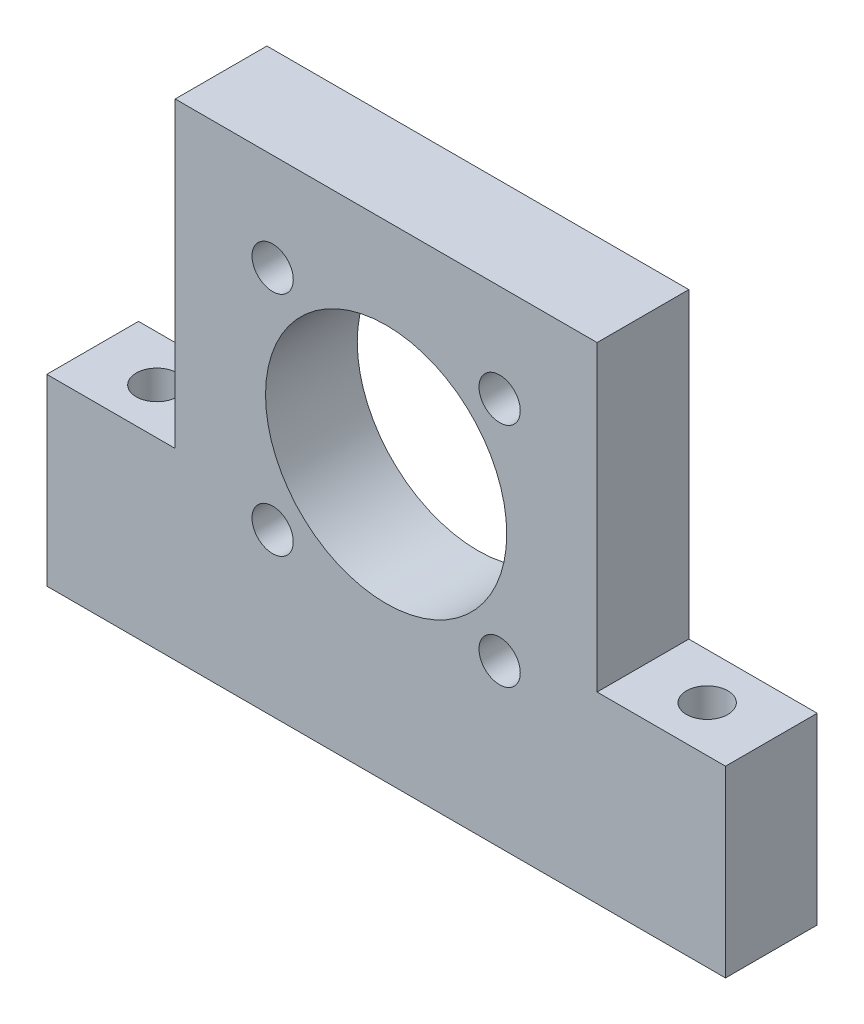
ISO-10303-21;
HEADER;
FILE_DESCRIPTION(('STEP AP214'),'2;1');
FILE_NAME('part.step','',(''),(''),'','','');
FILE_SCHEMA(('AUTOMOTIVE_DESIGN { 1 0 10303 214 1 1 1 1 }'));
ENDSEC;
DATA;
#1=APPLICATION_CONTEXT('core data for automotive mechanical design processes');
#2=APPLICATION_PROTOCOL_DEFINITION('international standard','automotive_design',2000,#1);
#3=PRODUCT_CONTEXT('',#1,'mechanical');
#4=PRODUCT('Part','Part','',(#3));
#5=PRODUCT_RELATED_PRODUCT_CATEGORY('part','',(#4));
#6=PRODUCT_DEFINITION_FORMATION('','',#4);
#7=PRODUCT_DEFINITION_CONTEXT('part definition',#1,'design');
#8=PRODUCT_DEFINITION('design','',#6,#7);
#9=PRODUCT_DEFINITION_SHAPE('','',#8);
#10=(LENGTH_UNIT() NAMED_UNIT(*) SI_UNIT(.MILLI.,.METRE.));
#11=(NAMED_UNIT(*) PLANE_ANGLE_UNIT() SI_UNIT($,.RADIAN.));
#12=(NAMED_UNIT(*) SI_UNIT($,.STERADIAN.) SOLID_ANGLE_UNIT());
#13=UNCERTAINTY_MEASURE_WITH_UNIT(LENGTH_MEASURE(1.E-05),#10,'distance_accuracy_value','');
#14=(GEOMETRIC_REPRESENTATION_CONTEXT(3) GLOBAL_UNCERTAINTY_ASSIGNED_CONTEXT((#13)) GLOBAL_UNIT_ASSIGNED_CONTEXT((#10,
#11,#12)) REPRESENTATION_CONTEXT('',''));
#15=CARTESIAN_POINT('',(0.,0.,0.));
#16=DIRECTION('',(0.,0.,1.));
#17=DIRECTION('',(1.,0.,0.));
#18=AXIS2_PLACEMENT_3D('',#15,#16,#17);
#19=CARTESIAN_POINT('',(0.,0.,10.));
#20=DIRECTION('',(0.,0.,-1.));
#21=DIRECTION('',(-1.,0.,0.));
#22=AXIS2_PLACEMENT_3D('',#19,#20,#21);
#23=PLANE('',#22);
#24=CARTESIAN_POINT('',(12.3743686707646,-12.3743686707646,10.));
#25=DIRECTION('',(0.,0.,1.));
#26=DIRECTION('',(0.,-1.,0.));
#27=AXIS2_PLACEMENT_3D('',#24,#25,#26);
#28=CIRCLE('',#27,2.25);
#29=CARTESIAN_POINT('',(12.3743686707646,-14.6243686707646,10.));
#30=VERTEX_POINT('',#29);
#31=EDGE_CURVE('E219',#30,#30,#28,.T.);
#32=ORIENTED_EDGE('',*,*,#31,.F.);
#33=EDGE_LOOP('',(#32));
#34=FACE_BOUND('',#33,.T.);
#35=CARTESIAN_POINT('',(-12.3743686707645,-12.3743686707646,10.));
#36=DIRECTION('',(0.,0.,1.));
#37=DIRECTION('',(-1.,0.,0.));
#38=AXIS2_PLACEMENT_3D('',#35,#36,#37);
#39=CIRCLE('',#38,2.25);
#40=CARTESIAN_POINT('',(-14.6243686707645,-12.3743686707646,10.));
#41=VERTEX_POINT('',#40);
#42=EDGE_CURVE('E213',#41,#41,#39,.T.);
#43=ORIENTED_EDGE('',*,*,#42,.F.);
#44=EDGE_LOOP('',(#43));
#45=FACE_BOUND('',#44,.T.);
#46=CARTESIAN_POINT('',(-12.3743686707645,12.3743686707646,10.));
#47=DIRECTION('',(0.,0.,1.));
#48=DIRECTION('',(0.,1.,0.));
#49=AXIS2_PLACEMENT_3D('',#46,#47,#48);
#50=CIRCLE('',#49,2.25);
#51=CARTESIAN_POINT('',(-12.3743686707645,14.6243686707646,10.));
#52=VERTEX_POINT('',#51);
#53=EDGE_CURVE('E207',#52,#52,#50,.T.);
#54=ORIENTED_EDGE('',*,*,#53,.F.);
#55=EDGE_LOOP('',(#54));
#56=FACE_BOUND('',#55,.T.);
#57=CARTESIAN_POINT('',(12.3743686707645,12.3743686707646,10.));
#58=DIRECTION('',(0.,0.,1.));
#59=DIRECTION('',(1.,0.,0.));
#60=AXIS2_PLACEMENT_3D('',#57,#58,#59);
#61=CIRCLE('',#60,2.25);
#62=CARTESIAN_POINT('',(14.6243686707645,12.3743686707646,10.));
#63=VERTEX_POINT('',#62);
#64=EDGE_CURVE('E201',#63,#63,#61,.T.);
#65=ORIENTED_EDGE('',*,*,#64,.F.);
#66=EDGE_LOOP('',(#65));
#67=FACE_BOUND('',#66,.T.);
#68=DIRECTION('',(0.,-1.,0.));
#69=VECTOR('',#68,1.);
#70=CARTESIAN_POINT('',(-23.,23.,10.));
#71=LINE('',#70,#69);
#72=CARTESIAN_POINT('',(-23.,23.,10.));
#73=VERTEX_POINT('',#72);
#74=CARTESIAN_POINT('',(-23.,-9.99999999999999,10.));
#75=VERTEX_POINT('',#74);
#76=EDGE_CURVE('E149',#73,#75,#71,.T.);
#77=ORIENTED_EDGE('',*,*,#76,.T.);
#78=DIRECTION('',(-1.,0.,0.));
#79=VECTOR('',#78,1.);
#80=CARTESIAN_POINT('',(-23.,-9.99999999999999,10.));
#81=LINE('',#80,#79);
#82=CARTESIAN_POINT('',(-37.,-9.99999999999999,10.));
#83=VERTEX_POINT('',#82);
#84=EDGE_CURVE('E97',#75,#83,#81,.T.);
#85=ORIENTED_EDGE('',*,*,#84,.T.);
#86=DIRECTION('',(0.,-1.,0.));
#87=VECTOR('',#86,1.);
#88=CARTESIAN_POINT('',(-37.,-9.99999999999999,10.));
#89=LINE('',#88,#87);
#90=CARTESIAN_POINT('',(-37.,-30.,10.));
#91=VERTEX_POINT('',#90);
#92=EDGE_CURVE('E164',#83,#91,#89,.T.);
#93=ORIENTED_EDGE('',*,*,#92,.T.);
#94=DIRECTION('',(1.,0.,0.));
#95=VECTOR('',#94,1.);
#96=CARTESIAN_POINT('',(-37.,-30.,10.));
#97=LINE('',#96,#95);
#98=CARTESIAN_POINT('',(37.,-30.,10.));
#99=VERTEX_POINT('',#98);
#100=EDGE_CURVE('E177',#91,#99,#97,.T.);
#101=ORIENTED_EDGE('',*,*,#100,.T.);
#102=DIRECTION('',(0.,1.,0.));
#103=VECTOR('',#102,1.);
#104=CARTESIAN_POINT('',(37.,-9.99999999999999,10.));
#105=LINE('',#104,#103);
#106=CARTESIAN_POINT('',(37.,-9.99999999999999,10.));
#107=VERTEX_POINT('',#106);
#108=EDGE_CURVE('E116',#99,#107,#105,.T.);
#109=ORIENTED_EDGE('',*,*,#108,.T.);
#110=DIRECTION('',(-1.,0.,0.));
#111=VECTOR('',#110,1.);
#112=CARTESIAN_POINT('',(23.,-9.99999999999999,10.));
#113=LINE('',#112,#111);
#114=CARTESIAN_POINT('',(23.,-9.99999999999999,10.));
#115=VERTEX_POINT('',#114);
#116=EDGE_CURVE('E110',#107,#115,#113,.T.);
#117=ORIENTED_EDGE('',*,*,#116,.T.);
#118=DIRECTION('',(0.,1.,0.));
#119=VECTOR('',#118,1.);
#120=CARTESIAN_POINT('',(23.,23.,10.));
#121=LINE('',#120,#119);
#122=CARTESIAN_POINT('',(23.,23.,10.));
#123=VERTEX_POINT('',#122);
#124=EDGE_CURVE('E114',#115,#123,#121,.T.);
#125=ORIENTED_EDGE('',*,*,#124,.T.);
#126=DIRECTION('',(-1.,0.,0.));
#127=VECTOR('',#126,1.);
#128=CARTESIAN_POINT('',(-23.,23.,10.));
#129=LINE('',#128,#127);
#130=EDGE_CURVE('E54',#123,#73,#129,.T.);
#131=ORIENTED_EDGE('',*,*,#130,.T.);
#132=EDGE_LOOP('',(#77,#85,#93,#101,#109,#117,#125,#131));
#133=FACE_BOUND('',#132,.T.);
#134=CARTESIAN_POINT('',(0.,0.,10.));
#135=DIRECTION('',(0.,0.,1.));
#136=DIRECTION('',(1.,0.,0.));
#137=AXIS2_PLACEMENT_3D('',#134,#135,#136);
#138=CIRCLE('',#137,13.15);
#139=CARTESIAN_POINT('',(13.15,0.,10.));
#140=VERTEX_POINT('',#139);
#141=EDGE_CURVE('E138',#140,#140,#138,.T.);
#142=ORIENTED_EDGE('',*,*,#141,.F.);
#143=EDGE_LOOP('',(#142));
#144=FACE_BOUND('',#143,.T.);
#145=ADVANCED_FACE('F37',(#34,#45,#56,#67,#133,#144),#23,.F.);
#146=CARTESIAN_POINT('',(0.,0.,0.));
#147=DIRECTION('',(0.,0.,-1.));
#148=DIRECTION('',(-1.,0.,0.));
#149=AXIS2_PLACEMENT_3D('',#146,#147,#148);
#150=PLANE('',#149);
#151=CARTESIAN_POINT('',(12.3743686707646,-12.3743686707646,0.));
#152=DIRECTION('',(0.,0.,1.));
#153=DIRECTION('',(0.,-1.,0.));
#154=AXIS2_PLACEMENT_3D('',#151,#152,#153);
#155=CIRCLE('',#154,2.25);
#156=CARTESIAN_POINT('',(12.3743686707646,-14.6243686707646,0.));
#157=VERTEX_POINT('',#156);
#158=EDGE_CURVE('E204',#157,#157,#155,.T.);
#159=ORIENTED_EDGE('',*,*,#158,.T.);
#160=EDGE_LOOP('',(#159));
#161=FACE_BOUND('',#160,.T.);
#162=CARTESIAN_POINT('',(-12.3743686707645,-12.3743686707646,0.));
#163=DIRECTION('',(0.,0.,1.));
#164=DIRECTION('',(-1.,0.,0.));
#165=AXIS2_PLACEMENT_3D('',#162,#163,#164);
#166=CIRCLE('',#165,2.25);
#167=CARTESIAN_POINT('',(-14.6243686707645,-12.3743686707646,0.));
#168=VERTEX_POINT('',#167);
#169=EDGE_CURVE('E216',#168,#168,#166,.T.);
#170=ORIENTED_EDGE('',*,*,#169,.T.);
#171=EDGE_LOOP('',(#170));
#172=FACE_BOUND('',#171,.T.);
#173=CARTESIAN_POINT('',(-12.3743686707645,12.3743686707646,0.));
#174=DIRECTION('',(0.,0.,1.));
#175=DIRECTION('',(0.,1.,0.));
#176=AXIS2_PLACEMENT_3D('',#173,#174,#175);
#177=CIRCLE('',#176,2.25);
#178=CARTESIAN_POINT('',(-12.3743686707645,14.6243686707646,0.));
#179=VERTEX_POINT('',#178);
#180=EDGE_CURVE('E210',#179,#179,#177,.T.);
#181=ORIENTED_EDGE('',*,*,#180,.T.);
#182=EDGE_LOOP('',(#181));
#183=FACE_BOUND('',#182,.T.);
#184=CARTESIAN_POINT('',(12.3743686707645,12.3743686707646,0.));
#185=DIRECTION('',(0.,0.,1.));
#186=DIRECTION('',(1.,0.,0.));
#187=AXIS2_PLACEMENT_3D('',#184,#185,#186);
#188=CIRCLE('',#187,2.25);
#189=CARTESIAN_POINT('',(14.6243686707645,12.3743686707646,0.));
#190=VERTEX_POINT('',#189);
#191=EDGE_CURVE('E196',#190,#190,#188,.T.);
#192=ORIENTED_EDGE('',*,*,#191,.T.);
#193=EDGE_LOOP('',(#192));
#194=FACE_BOUND('',#193,.T.);
#195=DIRECTION('',(0.,-1.,0.));
#196=VECTOR('',#195,1.);
#197=CARTESIAN_POINT('',(-23.,23.,0.));
#198=LINE('',#197,#196);
#199=CARTESIAN_POINT('',(-23.,23.,0.));
#200=VERTEX_POINT('',#199);
#201=CARTESIAN_POINT('',(-23.,-9.99999999999999,0.));
#202=VERTEX_POINT('',#201);
#203=EDGE_CURVE('E134',#200,#202,#198,.T.);
#204=ORIENTED_EDGE('',*,*,#203,.F.);
#205=DIRECTION('',(-1.,0.,0.));
#206=VECTOR('',#205,1.);
#207=CARTESIAN_POINT('',(-23.,23.,0.));
#208=LINE('',#207,#206);
#209=CARTESIAN_POINT('',(23.,23.,0.));
#210=VERTEX_POINT('',#209);
#211=EDGE_CURVE('E89',#210,#200,#208,.T.);
#212=ORIENTED_EDGE('',*,*,#211,.F.);
#213=DIRECTION('',(0.,1.,0.));
#214=VECTOR('',#213,1.);
#215=CARTESIAN_POINT('',(23.,23.,0.));
#216=LINE('',#215,#214);
#217=CARTESIAN_POINT('',(23.,-9.99999999999999,0.));
#218=VERTEX_POINT('',#217);
#219=EDGE_CURVE('E83',#218,#210,#216,.T.);
#220=ORIENTED_EDGE('',*,*,#219,.F.);
#221=DIRECTION('',(-1.,0.,0.));
#222=VECTOR('',#221,1.);
#223=CARTESIAN_POINT('',(23.,-9.99999999999999,0.));
#224=LINE('',#223,#222);
#225=CARTESIAN_POINT('',(37.,-9.99999999999999,0.));
#226=VERTEX_POINT('',#225);
#227=EDGE_CURVE('E124',#226,#218,#224,.T.);
#228=ORIENTED_EDGE('',*,*,#227,.F.);
#229=DIRECTION('',(0.,1.,0.));
#230=VECTOR('',#229,1.);
#231=CARTESIAN_POINT('',(37.,-9.99999999999999,0.));
#232=LINE('',#231,#230);
#233=CARTESIAN_POINT('',(37.,-30.,0.));
#234=VERTEX_POINT('',#233);
#235=EDGE_CURVE('E144',#234,#226,#232,.T.);
#236=ORIENTED_EDGE('',*,*,#235,.F.);
#237=DIRECTION('',(1.,0.,0.));
#238=VECTOR('',#237,1.);
#239=CARTESIAN_POINT('',(-37.,-30.,0.));
#240=LINE('',#239,#238);
#241=CARTESIAN_POINT('',(-37.,-30.,0.));
#242=VERTEX_POINT('',#241);
#243=EDGE_CURVE('E142',#242,#234,#240,.T.);
#244=ORIENTED_EDGE('',*,*,#243,.F.);
#245=DIRECTION('',(0.,-1.,0.));
#246=VECTOR('',#245,1.);
#247=CARTESIAN_POINT('',(-37.,-9.99999999999999,0.));
#248=LINE('',#247,#246);
#249=CARTESIAN_POINT('',(-37.,-9.99999999999999,0.));
#250=VERTEX_POINT('',#249);
#251=EDGE_CURVE('E140',#250,#242,#248,.T.);
#252=ORIENTED_EDGE('',*,*,#251,.F.);
#253=DIRECTION('',(-1.,0.,0.));
#254=VECTOR('',#253,1.);
#255=CARTESIAN_POINT('',(-23.,-9.99999999999999,0.));
#256=LINE('',#255,#254);
#257=EDGE_CURVE('E137',#202,#250,#256,.T.);
#258=ORIENTED_EDGE('',*,*,#257,.F.);
#259=EDGE_LOOP('',(#204,#212,#220,#228,#236,#244,#252,#258));
#260=FACE_BOUND('',#259,.T.);
#261=CARTESIAN_POINT('',(0.,0.,0.));
#262=DIRECTION('',(0.,0.,1.));
#263=DIRECTION('',(1.,0.,0.));
#264=AXIS2_PLACEMENT_3D('',#261,#262,#263);
#265=CIRCLE('',#264,13.15);
#266=CARTESIAN_POINT('',(13.15,0.,0.));
#267=VERTEX_POINT('',#266);
#268=EDGE_CURVE('E183',#267,#267,#265,.T.);
#269=ORIENTED_EDGE('',*,*,#268,.T.);
#270=EDGE_LOOP('',(#269));
#271=FACE_BOUND('',#270,.T.);
#272=ADVANCED_FACE('F168',(#161,#172,#183,#194,#260,#271),#150,.T.);
#273=CARTESIAN_POINT('',(-23.,23.,10.));
#274=DIRECTION('',(1.,0.,0.));
#275=DIRECTION('',(0.,1.,0.));
#276=AXIS2_PLACEMENT_3D('',#273,#274,#275);
#277=PLANE('',#276);
#278=ORIENTED_EDGE('',*,*,#203,.T.);
#279=DIRECTION('',(0.,0.,-1.));
#280=VECTOR('',#279,1.);
#281=CARTESIAN_POINT('',(-23.,-9.99999999999999,10.));
#282=LINE('',#281,#280);
#283=EDGE_CURVE('E11',#75,#202,#282,.T.);
#284=ORIENTED_EDGE('',*,*,#283,.F.);
#285=ORIENTED_EDGE('',*,*,#76,.F.);
#286=DIRECTION('',(0.,0.,-1.));
#287=VECTOR('',#286,1.);
#288=CARTESIAN_POINT('',(-23.,23.,10.));
#289=LINE('',#288,#287);
#290=EDGE_CURVE('E130',#73,#200,#289,.T.);
#291=ORIENTED_EDGE('',*,*,#290,.T.);
#292=EDGE_LOOP('',(#278,#284,#285,#291));
#293=FACE_BOUND('',#292,.T.);
#294=ADVANCED_FACE('F39',(#293),#277,.F.);
#295=CARTESIAN_POINT('',(-23.,-9.99999999999999,10.));
#296=DIRECTION('',(0.,-1.,0.));
#297=DIRECTION('',(0.,0.,-1.));
#298=AXIS2_PLACEMENT_3D('',#295,#296,#297);
#299=PLANE('',#298);
#300=CARTESIAN_POINT('',(-30.,-9.99999999999999,5.));
#301=DIRECTION('',(0.,-1.,0.));
#302=DIRECTION('',(0.,0.,-1.));
#303=AXIS2_PLACEMENT_3D('',#300,#301,#302);
#304=CIRCLE('',#303,2.25);
#305=CARTESIAN_POINT('',(-30.,-9.99999999999999,2.75));
#306=VERTEX_POINT('',#305);
#307=EDGE_CURVE('E186',#306,#306,#304,.F.);
#308=ORIENTED_EDGE('',*,*,#307,.F.);
#309=EDGE_LOOP('',(#308));
#310=FACE_BOUND('',#309,.T.);
#311=ORIENTED_EDGE('',*,*,#257,.T.);
#312=DIRECTION('',(0.,0.,-1.));
#313=VECTOR('',#312,1.);
#314=CARTESIAN_POINT('',(-37.,-9.99999999999999,10.));
#315=LINE('',#314,#313);
#316=EDGE_CURVE('E46',#83,#250,#315,.T.);
#317=ORIENTED_EDGE('',*,*,#316,.F.);
#318=ORIENTED_EDGE('',*,*,#84,.F.);
#319=ORIENTED_EDGE('',*,*,#283,.T.);
#320=EDGE_LOOP('',(#311,#317,#318,#319));
#321=FACE_BOUND('',#320,.T.);
#322=ADVANCED_FACE('F284',(#310,#321),#299,.F.);
#323=CARTESIAN_POINT('',(-37.,-9.99999999999999,10.));
#324=DIRECTION('',(1.,0.,0.));
#325=DIRECTION('',(0.,0.,-1.));
#326=AXIS2_PLACEMENT_3D('',#323,#324,#325);
#327=PLANE('',#326);
#328=ORIENTED_EDGE('',*,*,#251,.T.);
#329=DIRECTION('',(0.,0.,-1.));
#330=VECTOR('',#329,1.);
#331=CARTESIAN_POINT('',(-37.,-30.,10.));
#332=LINE('',#331,#330);
#333=EDGE_CURVE('E156',#91,#242,#332,.T.);
#334=ORIENTED_EDGE('',*,*,#333,.F.);
#335=ORIENTED_EDGE('',*,*,#92,.F.);
#336=ORIENTED_EDGE('',*,*,#316,.T.);
#337=EDGE_LOOP('',(#328,#334,#335,#336));
#338=FACE_BOUND('',#337,.T.);
#339=ADVANCED_FACE('F162',(#338),#327,.F.);
#340=CARTESIAN_POINT('',(-37.,-30.,10.));
#341=DIRECTION('',(0.,1.,0.));
#342=DIRECTION('',(0.,0.,1.));
#343=AXIS2_PLACEMENT_3D('',#340,#341,#342);
#344=PLANE('',#343);
#345=CARTESIAN_POINT('',(-30.,-30.,5.));
#346=DIRECTION('',(0.,-1.,0.));
#347=DIRECTION('',(0.,0.,-1.));
#348=AXIS2_PLACEMENT_3D('',#345,#346,#347);
#349=CIRCLE('',#348,2.25);
#350=CARTESIAN_POINT('',(-30.,-30.,2.75));
#351=VERTEX_POINT('',#350);
#352=EDGE_CURVE('E192',#351,#351,#349,.T.);
#353=ORIENTED_EDGE('',*,*,#352,.F.);
#354=EDGE_LOOP('',(#353));
#355=FACE_BOUND('',#354,.T.);
#356=CARTESIAN_POINT('',(30.,-30.,5.00000000000001));
#357=DIRECTION('',(0.,-1.,0.));
#358=DIRECTION('',(0.,0.,1.));
#359=AXIS2_PLACEMENT_3D('',#356,#357,#358);
#360=CIRCLE('',#359,2.25);
#361=CARTESIAN_POINT('',(30.,-30.,7.25000000000001));
#362=VERTEX_POINT('',#361);
#363=EDGE_CURVE('E189',#362,#362,#360,.T.);
#364=ORIENTED_EDGE('',*,*,#363,.F.);
#365=EDGE_LOOP('',(#364));
#366=FACE_BOUND('',#365,.T.);
#367=ORIENTED_EDGE('',*,*,#243,.T.);
#368=DIRECTION('',(0.,0.,-1.));
#369=VECTOR('',#368,1.);
#370=CARTESIAN_POINT('',(37.,-30.,10.));
#371=LINE('',#370,#369);
#372=EDGE_CURVE('E153',#99,#234,#371,.T.);
#373=ORIENTED_EDGE('',*,*,#372,.F.);
#374=ORIENTED_EDGE('',*,*,#100,.F.);
#375=ORIENTED_EDGE('',*,*,#333,.T.);
#376=EDGE_LOOP('',(#367,#373,#374,#375));
#377=FACE_BOUND('',#376,.T.);
#378=ADVANCED_FACE('F173',(#355,#366,#377),#344,.F.);
#379=CARTESIAN_POINT('',(37.,-9.99999999999999,10.));
#380=DIRECTION('',(-1.,0.,0.));
#381=DIRECTION('',(0.,0.,1.));
#382=AXIS2_PLACEMENT_3D('',#379,#380,#381);
#383=PLANE('',#382);
#384=ORIENTED_EDGE('',*,*,#235,.T.);
#385=DIRECTION('',(0.,0.,-1.));
#386=VECTOR('',#385,1.);
#387=CARTESIAN_POINT('',(37.,-9.99999999999999,10.));
#388=LINE('',#387,#386);
#389=EDGE_CURVE('E125',#107,#226,#388,.T.);
#390=ORIENTED_EDGE('',*,*,#389,.F.);
#391=ORIENTED_EDGE('',*,*,#108,.F.);
#392=ORIENTED_EDGE('',*,*,#372,.T.);
#393=EDGE_LOOP('',(#384,#390,#391,#392));
#394=FACE_BOUND('',#393,.T.);
#395=ADVANCED_FACE('F176',(#394),#383,.F.);
#396=CARTESIAN_POINT('',(23.,-9.99999999999999,10.));
#397=DIRECTION('',(0.,-1.,0.));
#398=DIRECTION('',(0.,0.,-1.));
#399=AXIS2_PLACEMENT_3D('',#396,#397,#398);
#400=PLANE('',#399);
#401=CARTESIAN_POINT('',(30.,-9.99999999999999,5.00000000000001));
#402=DIRECTION('',(0.,-1.,0.));
#403=DIRECTION('',(0.,0.,-1.));
#404=AXIS2_PLACEMENT_3D('',#401,#402,#403);
#405=CIRCLE('',#404,2.25);
#406=CARTESIAN_POINT('',(30.,-9.99999999999999,2.75));
#407=VERTEX_POINT('',#406);
#408=EDGE_CURVE('E193',#407,#407,#405,.F.);
#409=ORIENTED_EDGE('',*,*,#408,.F.);
#410=EDGE_LOOP('',(#409));
#411=FACE_BOUND('',#410,.T.);
#412=ORIENTED_EDGE('',*,*,#227,.T.);
#413=DIRECTION('',(0.,0.,-1.));
#414=VECTOR('',#413,1.);
#415=CARTESIAN_POINT('',(23.,-9.99999999999999,10.));
#416=LINE('',#415,#414);
#417=EDGE_CURVE('E121',#115,#218,#416,.T.);
#418=ORIENTED_EDGE('',*,*,#417,.F.);
#419=ORIENTED_EDGE('',*,*,#116,.F.);
#420=ORIENTED_EDGE('',*,*,#389,.T.);
#421=EDGE_LOOP('',(#412,#418,#419,#420));
#422=FACE_BOUND('',#421,.T.);
#423=ADVANCED_FACE('F122',(#411,#422),#400,.F.);
#424=CARTESIAN_POINT('',(23.,23.,10.));
#425=DIRECTION('',(-1.,0.,0.));
#426=DIRECTION('',(0.,-1.,0.));
#427=AXIS2_PLACEMENT_3D('',#424,#425,#426);
#428=PLANE('',#427);
#429=ORIENTED_EDGE('',*,*,#219,.T.);
#430=DIRECTION('',(0.,0.,-1.));
#431=VECTOR('',#430,1.);
#432=CARTESIAN_POINT('',(23.,23.,10.));
#433=LINE('',#432,#431);
#434=EDGE_CURVE('E126',#123,#210,#433,.T.);
#435=ORIENTED_EDGE('',*,*,#434,.F.);
#436=ORIENTED_EDGE('',*,*,#124,.F.);
#437=ORIENTED_EDGE('',*,*,#417,.T.);
#438=EDGE_LOOP('',(#429,#435,#436,#437));
#439=FACE_BOUND('',#438,.T.);
#440=ADVANCED_FACE('F128',(#439),#428,.F.);
#441=CARTESIAN_POINT('',(-23.,23.,10.));
#442=DIRECTION('',(0.,-1.,0.));
#443=DIRECTION('',(0.,0.,-1.));
#444=AXIS2_PLACEMENT_3D('',#441,#442,#443);
#445=PLANE('',#444);
#446=ORIENTED_EDGE('',*,*,#211,.T.);
#447=ORIENTED_EDGE('',*,*,#290,.F.);
#448=ORIENTED_EDGE('',*,*,#130,.F.);
#449=ORIENTED_EDGE('',*,*,#434,.T.);
#450=EDGE_LOOP('',(#446,#447,#448,#449));
#451=FACE_BOUND('',#450,.T.);
#452=ADVANCED_FACE('F266',(#451),#445,.F.);
#453=CARTESIAN_POINT('',(0.,0.,10.));
#454=DIRECTION('',(0.,0.,-1.));
#455=DIRECTION('',(-1.,0.,0.));
#456=AXIS2_PLACEMENT_3D('',#453,#454,#455);
#457=CYLINDRICAL_SURFACE('',#456,13.15);
#458=ORIENTED_EDGE('',*,*,#141,.T.);
#459=EDGE_LOOP('',(#458));
#460=FACE_BOUND('',#459,.T.);
#461=ORIENTED_EDGE('',*,*,#268,.F.);
#462=EDGE_LOOP('',(#461));
#463=FACE_BOUND('',#462,.T.);
#464=ADVANCED_FACE('F263',(#460,#463),#457,.F.);
#465=CARTESIAN_POINT('',(30.,23.001,5.00000000000001));
#466=DIRECTION('',(0.,-1.,0.));
#467=DIRECTION('',(0.,0.,-1.));
#468=AXIS2_PLACEMENT_3D('',#465,#466,#467);
#469=CYLINDRICAL_SURFACE('',#468,2.25);
#470=ORIENTED_EDGE('',*,*,#363,.T.);
#471=EDGE_LOOP('',(#470));
#472=FACE_BOUND('',#471,.T.);
#473=ORIENTED_EDGE('',*,*,#408,.T.);
#474=EDGE_LOOP('',(#473));
#475=FACE_BOUND('',#474,.T.);
#476=ADVANCED_FACE('F255',(#472,#475),#469,.F.);
#477=CARTESIAN_POINT('',(-30.,23.001,5.));
#478=DIRECTION('',(0.,-1.,0.));
#479=DIRECTION('',(0.,0.,-1.));
#480=AXIS2_PLACEMENT_3D('',#477,#478,#479);
#481=CYLINDRICAL_SURFACE('',#480,2.25);
#482=ORIENTED_EDGE('',*,*,#352,.T.);
#483=EDGE_LOOP('',(#482));
#484=FACE_BOUND('',#483,.T.);
#485=ORIENTED_EDGE('',*,*,#307,.T.);
#486=EDGE_LOOP('',(#485));
#487=FACE_BOUND('',#486,.T.);
#488=ADVANCED_FACE('F246',(#484,#487),#481,.F.);
#489=CARTESIAN_POINT('',(12.3743686707645,12.3743686707646,0.));
#490=DIRECTION('',(0.,0.,1.));
#491=DIRECTION('',(1.,0.,0.));
#492=AXIS2_PLACEMENT_3D('',#489,#490,#491);
#493=CYLINDRICAL_SURFACE('',#492,2.25);
#494=ORIENTED_EDGE('',*,*,#191,.F.);
#495=EDGE_LOOP('',(#494));
#496=FACE_BOUND('',#495,.T.);
#497=ORIENTED_EDGE('',*,*,#64,.T.);
#498=EDGE_LOOP('',(#497));
#499=FACE_BOUND('',#498,.T.);
#500=ADVANCED_FACE('F243',(#496,#499),#493,.F.);
#501=CARTESIAN_POINT('',(-12.3743686707645,12.3743686707646,0.));
#502=DIRECTION('',(0.,0.,1.));
#503=DIRECTION('',(1.,0.,0.));
#504=AXIS2_PLACEMENT_3D('',#501,#502,#503);
#505=CYLINDRICAL_SURFACE('',#504,2.25);
#506=ORIENTED_EDGE('',*,*,#180,.F.);
#507=EDGE_LOOP('',(#506));
#508=FACE_BOUND('',#507,.T.);
#509=ORIENTED_EDGE('',*,*,#53,.T.);
#510=EDGE_LOOP('',(#509));
#511=FACE_BOUND('',#510,.T.);
#512=ADVANCED_FACE('F245',(#508,#511),#505,.F.);
#513=CARTESIAN_POINT('',(-12.3743686707645,-12.3743686707646,0.));
#514=DIRECTION('',(0.,0.,1.));
#515=DIRECTION('',(1.,0.,0.));
#516=AXIS2_PLACEMENT_3D('',#513,#514,#515);
#517=CYLINDRICAL_SURFACE('',#516,2.25);
#518=ORIENTED_EDGE('',*,*,#169,.F.);
#519=EDGE_LOOP('',(#518));
#520=FACE_BOUND('',#519,.T.);
#521=ORIENTED_EDGE('',*,*,#42,.T.);
#522=EDGE_LOOP('',(#521));
#523=FACE_BOUND('',#522,.T.);
#524=ADVANCED_FACE('F230',(#520,#523),#517,.F.);
#525=CARTESIAN_POINT('',(12.3743686707646,-12.3743686707646,0.));
#526=DIRECTION('',(0.,0.,1.));
#527=DIRECTION('',(1.,0.,0.));
#528=AXIS2_PLACEMENT_3D('',#525,#526,#527);
#529=CYLINDRICAL_SURFACE('',#528,2.25);
#530=ORIENTED_EDGE('',*,*,#158,.F.);
#531=EDGE_LOOP('',(#530));
#532=FACE_BOUND('',#531,.T.);
#533=ORIENTED_EDGE('',*,*,#31,.T.);
#534=EDGE_LOOP('',(#533));
#535=FACE_BOUND('',#534,.T.);
#536=ADVANCED_FACE('F227',(#532,#535),#529,.F.);
#537=CLOSED_SHELL('',(#145,#272,#294,#322,#339,#378,#395,#423,#440,#452,#464,#476,#488,#500,
#512,#524,#536));
#538=MANIFOLD_SOLID_BREP('B2',#537);
#539=ADVANCED_BREP_SHAPE_REPRESENTATION('',(#18,#538),#14);
#540=SHAPE_DEFINITION_REPRESENTATION(#9,#539);
ENDSEC;
END-ISO-10303-21;
